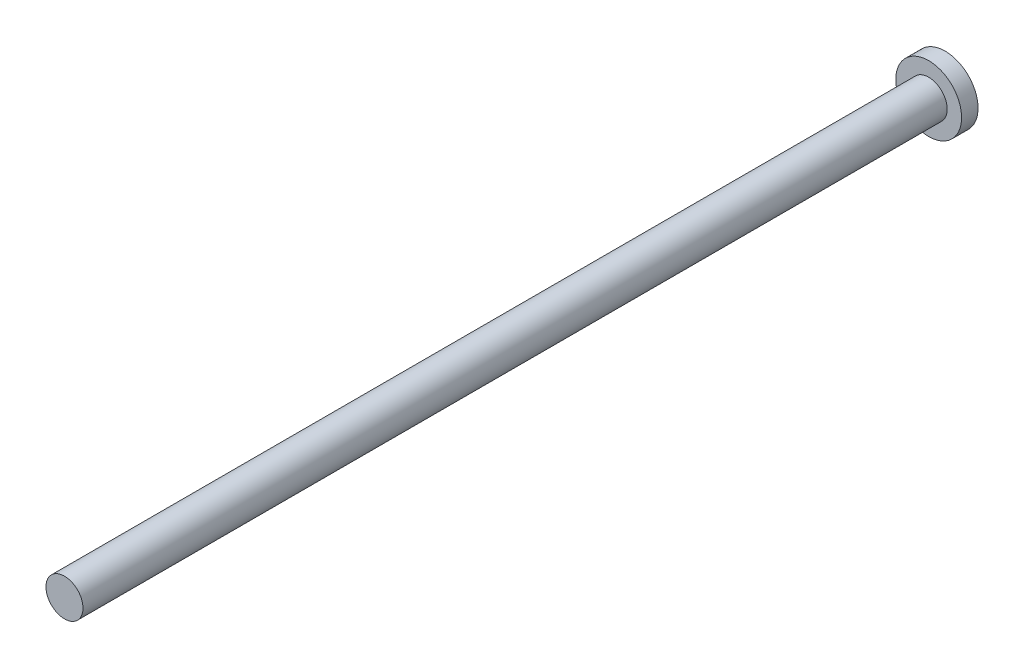
ISO-10303-21;
HEADER;
FILE_DESCRIPTION(('STEP AP214'),'2;1');
FILE_NAME('part.step','',(''),(''),'','','');
FILE_SCHEMA(('AUTOMOTIVE_DESIGN { 1 0 10303 214 1 1 1 1 }'));
ENDSEC;
DATA;
#1=APPLICATION_CONTEXT('core data for automotive mechanical design processes');
#2=APPLICATION_PROTOCOL_DEFINITION('international standard','automotive_design',2000,#1);
#3=PRODUCT_CONTEXT('',#1,'mechanical');
#4=PRODUCT('Part','Part','',(#3));
#5=PRODUCT_RELATED_PRODUCT_CATEGORY('part','',(#4));
#6=PRODUCT_DEFINITION_FORMATION('','',#4);
#7=PRODUCT_DEFINITION_CONTEXT('part definition',#1,'design');
#8=PRODUCT_DEFINITION('design','',#6,#7);
#9=PRODUCT_DEFINITION_SHAPE('','',#8);
#10=(LENGTH_UNIT() NAMED_UNIT(*) SI_UNIT(.MILLI.,.METRE.));
#11=(NAMED_UNIT(*) PLANE_ANGLE_UNIT() SI_UNIT($,.RADIAN.));
#12=(NAMED_UNIT(*) SI_UNIT($,.STERADIAN.) SOLID_ANGLE_UNIT());
#13=UNCERTAINTY_MEASURE_WITH_UNIT(LENGTH_MEASURE(1.E-05),#10,'distance_accuracy_value','');
#14=(GEOMETRIC_REPRESENTATION_CONTEXT(3) GLOBAL_UNCERTAINTY_ASSIGNED_CONTEXT((#13)) GLOBAL_UNIT_ASSIGNED_CONTEXT((#10,
#11,#12)) REPRESENTATION_CONTEXT('',''));
#15=CARTESIAN_POINT('',(0.,0.,0.));
#16=DIRECTION('',(0.,0.,1.));
#17=DIRECTION('',(1.,0.,0.));
#18=AXIS2_PLACEMENT_3D('',#15,#16,#17);
#19=CARTESIAN_POINT('',(0.,0.,133.35));
#20=DIRECTION('',(0.,0.,-1.));
#21=DIRECTION('',(-1.,0.,0.));
#22=AXIS2_PLACEMENT_3D('',#19,#20,#21);
#23=CYLINDRICAL_SURFACE('',#22,2.8575);
#24=CARTESIAN_POINT('',(0.,0.,133.35));
#25=DIRECTION('',(0.,0.,1.));
#26=DIRECTION('',(1.,0.,0.));
#27=AXIS2_PLACEMENT_3D('',#24,#25,#26);
#28=CIRCLE('',#27,2.8575);
#29=CARTESIAN_POINT('',(2.8575,0.,133.35));
#30=VERTEX_POINT('',#29);
#31=EDGE_CURVE('E10',#30,#30,#28,.T.);
#32=ORIENTED_EDGE('',*,*,#31,.F.);
#33=EDGE_LOOP('',(#32));
#34=FACE_BOUND('',#33,.T.);
#35=CARTESIAN_POINT('',(0.,0.,0.));
#36=DIRECTION('',(0.,0.,1.));
#37=DIRECTION('',(1.,0.,0.));
#38=AXIS2_PLACEMENT_3D('',#35,#36,#37);
#39=CIRCLE('',#38,2.8575);
#40=CARTESIAN_POINT('',(2.8575,0.,0.));
#41=VERTEX_POINT('',#40);
#42=EDGE_CURVE('E42',#41,#41,#39,.T.);
#43=ORIENTED_EDGE('',*,*,#42,.T.);
#44=EDGE_LOOP('',(#43));
#45=FACE_BOUND('',#44,.T.);
#46=ADVANCED_FACE('F39',(#34,#45),#23,.T.);
#47=CARTESIAN_POINT('',(0.,0.,133.35));
#48=DIRECTION('',(0.,0.,1.));
#49=DIRECTION('',(1.,0.,0.));
#50=AXIS2_PLACEMENT_3D('',#47,#48,#49);
#51=PLANE('',#50);
#52=ORIENTED_EDGE('',*,*,#31,.T.);
#53=EDGE_LOOP('',(#52));
#54=FACE_BOUND('',#53,.T.);
#55=ADVANCED_FACE('F62',(#54),#51,.T.);
#56=CARTESIAN_POINT('',(0.,0.,-2.54));
#57=DIRECTION('',(0.,0.,1.));
#58=DIRECTION('',(1.,0.,0.));
#59=AXIS2_PLACEMENT_3D('',#56,#57,#58);
#60=CYLINDRICAL_SURFACE('',#59,5.08);
#61=CARTESIAN_POINT('',(0.,0.,-2.54));
#62=DIRECTION('',(0.,0.,-1.));
#63=DIRECTION('',(-1.,0.,0.));
#64=AXIS2_PLACEMENT_3D('',#61,#62,#63);
#65=CIRCLE('',#64,5.08);
#66=CARTESIAN_POINT('',(-5.08,0.,-2.54));
#67=VERTEX_POINT('',#66);
#68=EDGE_CURVE('E49',#67,#67,#65,.T.);
#69=ORIENTED_EDGE('',*,*,#68,.F.);
#70=EDGE_LOOP('',(#69));
#71=FACE_BOUND('',#70,.T.);
#72=CARTESIAN_POINT('',(0.,0.,0.));
#73=DIRECTION('',(0.,0.,-1.));
#74=DIRECTION('',(-1.,0.,0.));
#75=AXIS2_PLACEMENT_3D('',#72,#73,#74);
#76=CIRCLE('',#75,5.08);
#77=CARTESIAN_POINT('',(-5.08,0.,0.));
#78=VERTEX_POINT('',#77);
#79=EDGE_CURVE('E51',#78,#78,#76,.T.);
#80=ORIENTED_EDGE('',*,*,#79,.T.);
#81=EDGE_LOOP('',(#80));
#82=FACE_BOUND('',#81,.T.);
#83=ADVANCED_FACE('F59',(#71,#82),#60,.T.);
#84=CARTESIAN_POINT('',(0.,0.,-2.54));
#85=DIRECTION('',(0.,0.,-1.));
#86=DIRECTION('',(-1.,0.,0.));
#87=AXIS2_PLACEMENT_3D('',#84,#85,#86);
#88=PLANE('',#87);
#89=ORIENTED_EDGE('',*,*,#68,.T.);
#90=EDGE_LOOP('',(#89));
#91=FACE_BOUND('',#90,.T.);
#92=ADVANCED_FACE('F57',(#91),#88,.T.);
#93=CARTESIAN_POINT('',(0.,0.,0.));
#94=DIRECTION('',(0.,0.,-1.));
#95=DIRECTION('',(-1.,0.,0.));
#96=AXIS2_PLACEMENT_3D('',#93,#94,#95);
#97=PLANE('',#96);
#98=ORIENTED_EDGE('',*,*,#42,.F.);
#99=EDGE_LOOP('',(#98));
#100=FACE_BOUND('',#99,.T.);
#101=ORIENTED_EDGE('',*,*,#79,.F.);
#102=EDGE_LOOP('',(#101));
#103=FACE_BOUND('',#102,.T.);
#104=ADVANCED_FACE('F66',(#100,#103),#97,.F.);
#105=CLOSED_SHELL('',(#46,#55,#83,#92,#104));
#106=MANIFOLD_SOLID_BREP('B2',#105);
#107=ADVANCED_BREP_SHAPE_REPRESENTATION('',(#18,#106),#14);
#108=SHAPE_DEFINITION_REPRESENTATION(#9,#107);
ENDSEC;
END-ISO-10303-21;
